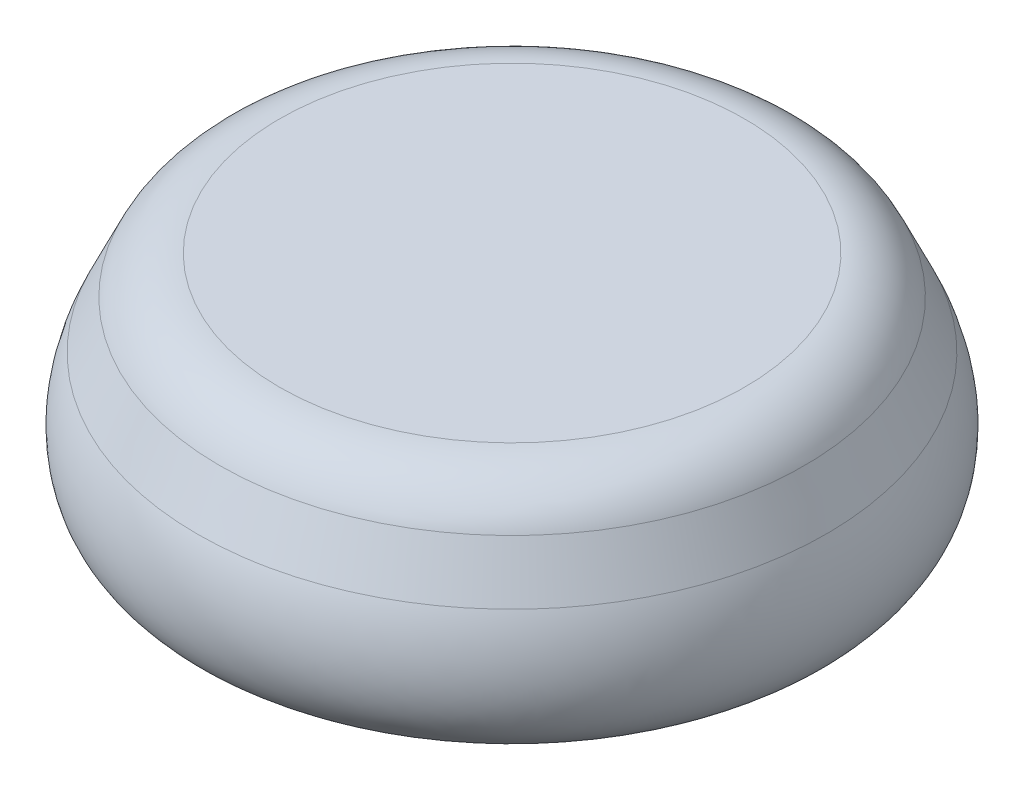
ISO-10303-21;
HEADER;
FILE_DESCRIPTION(('STEP AP214'),'2;1');
FILE_NAME('part.step','',(''),(''),'','','');
FILE_SCHEMA(('AUTOMOTIVE_DESIGN { 1 0 10303 214 1 1 1 1 }'));
ENDSEC;
DATA;
#1=APPLICATION_CONTEXT('core data for automotive mechanical design processes');
#2=APPLICATION_PROTOCOL_DEFINITION('international standard','automotive_design',2000,#1);
#3=PRODUCT_CONTEXT('',#1,'mechanical');
#4=PRODUCT('Part','Part','',(#3));
#5=PRODUCT_RELATED_PRODUCT_CATEGORY('part','',(#4));
#6=PRODUCT_DEFINITION_FORMATION('','',#4);
#7=PRODUCT_DEFINITION_CONTEXT('part definition',#1,'design');
#8=PRODUCT_DEFINITION('design','',#6,#7);
#9=PRODUCT_DEFINITION_SHAPE('','',#8);
#10=(LENGTH_UNIT() NAMED_UNIT(*) SI_UNIT(.MILLI.,.METRE.));
#11=(NAMED_UNIT(*) PLANE_ANGLE_UNIT() SI_UNIT($,.RADIAN.));
#12=(NAMED_UNIT(*) SI_UNIT($,.STERADIAN.) SOLID_ANGLE_UNIT());
#13=UNCERTAINTY_MEASURE_WITH_UNIT(LENGTH_MEASURE(1.E-05),#10,'distance_accuracy_value','');
#14=(GEOMETRIC_REPRESENTATION_CONTEXT(3) GLOBAL_UNCERTAINTY_ASSIGNED_CONTEXT((#13)) GLOBAL_UNIT_ASSIGNED_CONTEXT((#10,
#11,#12)) REPRESENTATION_CONTEXT('',''));
#15=CARTESIAN_POINT('',(0.,0.,0.));
#16=DIRECTION('',(0.,0.,1.));
#17=DIRECTION('',(1.,0.,0.));
#18=AXIS2_PLACEMENT_3D('',#15,#16,#17);
#19=CARTESIAN_POINT('',(-11.6679762873141,0.,0.596459581716547));
#20=DIRECTION('',(0.,-1.,0.));
#21=DIRECTION('',(0.,0.,1.));
#22=AXIS2_PLACEMENT_3D('',#19,#20,#21);
#23=CONICAL_SURFACE('',#22,50.,0.436332312998583);
#24=CARTESIAN_POINT('',(1.971137729193,-15.6207831098853,-55.0402335851226));
#25=CARTESIAN_POINT('',(5.64236667191444,-15.6207831099431,-54.1402464133692));
#26=CARTESIAN_POINT('',(9.16743775199461,-15.6210031784165,-52.894743181036));
#27=CARTESIAN_POINT('',(14.243639979586,-15.621651567128,-50.5268003486752));
#28=CARTESIAN_POINT('',(15.90021466265,-15.6219211342182,-49.653593232351));
#29=CARTESIAN_POINT('',(19.1405650034087,-15.6225698741891,-47.7351181115282));
#30=CARTESIAN_POINT('',(20.7243862406784,-15.6229500033657,-46.6881822347024));
#31=CARTESIAN_POINT('',(25.2613464455144,-15.6242303138001,-43.3575511813461));
#32=CARTESIAN_POINT('',(28.0391442339883,-15.625275570573,-40.865501455234));
#33=CARTESIAN_POINT('',(31.8369843340479,-15.6271299898261,-36.7215680331591));
#34=CARTESIAN_POINT('',(33.0464973622888,-15.6277997948163,-35.2646048722645));
#35=CARTESIAN_POINT('',(35.3092238797687,-15.6292220578336,-32.2458720922649));
#36=CARTESIAN_POINT('',(36.3579654939669,-15.6299706919091,-30.6918232195903));
#37=CARTESIAN_POINT('',(39.2634311790695,-15.632325895017,-25.899478337143));
#38=CARTESIAN_POINT('',(40.881697445195,-15.6340407196124,-22.5322288882323));
#39=CARTESIAN_POINT('',(42.8170945032546,-15.6368363939226,-17.2153082391851));
#40=CARTESIAN_POINT('',(43.3758064208412,-15.6378020851157,-15.4057033193318));
#41=CARTESIAN_POINT('',(44.3046518781029,-15.6397667785514,-11.7751654446573));
#42=CARTESIAN_POINT('',(44.6781495190115,-15.6407704165537,-9.94537783528216));
#43=CARTESIAN_POINT('',(45.2455896529415,-15.6428197478844,-6.25713390770196));
#44=CARTESIAN_POINT('',(45.4395336112451,-15.6438654408715,-4.39867782078086));
#45=CARTESIAN_POINT('',(45.644961907996,-15.645999570955,-0.652634540749525));
#46=CARTESIAN_POINT('',(45.6556385544505,-15.6470942671184,1.24559211638615));
#47=CARTESIAN_POINT('',(45.4077262851212,-15.6503884509901,6.88886791820799));
#48=CARTESIAN_POINT('',(44.8773319575814,-15.6525982983961,10.5849704928862));
#49=CARTESIAN_POINT('',(43.1021651834868,-15.6570448669042,17.8478785781363));
#50=CARTESIAN_POINT('',(41.8370203476568,-15.6593032545501,21.4471884357122));
#51=CARTESIAN_POINT('',(38.6715449427213,-15.6636711187045,28.2316470636949));
#52=CARTESIAN_POINT('',(36.771868441419,-15.6657961618882,31.4439125533216));
#53=CARTESIAN_POINT('',(33.4418755669411,-15.6688944077497,35.9894961084473));
#54=CARTESIAN_POINT('',(32.2447046447896,-15.6699167185447,37.4651802407817));
#55=CARTESIAN_POINT('',(29.7348491333675,-15.6718898047984,40.2643005876536));
#56=CARTESIAN_POINT('',(28.4188233150538,-15.6728445444926,41.5937791494662));
#57=CARTESIAN_POINT('',(24.291393885013,-15.6756153889683,45.3764965699799));
#58=CARTESIAN_POINT('',(21.299409308791,-15.6773405171972,47.6278657104503));
#59=CARTESIAN_POINT('',(14.8317854530362,-15.6805265960337,51.5546247459556));
#60=CARTESIAN_POINT('',(11.4585584279953,-15.681937552338,53.168627724657));
#61=CARTESIAN_POINT('',(6.19780596844434,-15.6837915314271,55.0861974189796));
#62=CARTESIAN_POINT('',(4.41048843804059,-15.6843654581605,55.6408600688656));
#63=CARTESIAN_POINT('',(0.766788107295939,-15.6854230840128,56.5771367790989));
#64=CARTESIAN_POINT('',(-1.09411303076597,-15.685907197346,56.9583593642882));
#65=CARTESIAN_POINT('',(-6.65951327192668,-15.6871914886198,57.8155452138973));
#66=CARTESIAN_POINT('',(-10.3853504394702,-15.687837574058,58.0196984811183));
#67=CARTESIAN_POINT('',(-17.8679704861788,-15.6887125729563,57.6988267685395));
#68=CARTESIAN_POINT('',(-21.6422931510177,-15.6889372553074,57.1621834494525));
#69=CARTESIAN_POINT('',(-27.1055683334721,-15.6889390708565,55.8260234890082));
#70=CARTESIAN_POINT('',(-28.9025851752225,-15.6888850369632,55.2920328274398));
#71=CARTESIAN_POINT('',(-32.4481364499676,-15.6886669271721,54.0456013995293));
#72=CARTESIAN_POINT('',(-34.2043851790198,-15.688501698097,53.3292748519063));
#73=CARTESIAN_POINT('',(-39.3287435372883,-15.6878447630083,50.9367754898072));
#74=CARTESIAN_POINT('',(-42.5547550481414,-15.687196060905,49.0238784052097));
#75=CARTESIAN_POINT('',(-47.1091400783055,-15.6859076945191,45.6788185409069));
#76=CARTESIAN_POINT('',(-48.5818124104418,-15.685423677082,44.4805495254316));
#77=CARTESIAN_POINT('',(-51.3737267083383,-15.6843685138478,41.9708674993467));
#78=CARTESIAN_POINT('',(-52.7005787318164,-15.6837955405553,40.6544280061905));
#79=CARTESIAN_POINT('',(-55.218558326715,-15.6825604533475,37.9005623702335));
#80=CARTESIAN_POINT('',(-56.4096834441434,-15.6818983377843,36.4631340485112));
#81=CARTESIAN_POINT('',(-58.6547531901579,-15.6804840209253,33.4659879818795));
#82=CARTESIAN_POINT('',(-59.7125266025193,-15.6797286503184,31.8998482917146));
#83=CARTESIAN_POINT('',(-62.6454351230221,-15.6773438054364,27.054809845952));
#84=CARTESIAN_POINT('',(-64.2549134302086,-15.6756226939282,23.6823611470962));
#85=CARTESIAN_POINT('',(-66.1672109848848,-15.6728506424561,18.416941003692));
#86=CARTESIAN_POINT('',(-66.7203806679788,-15.6718946633188,16.6270921573556));
#87=CARTESIAN_POINT('',(-67.6535803155524,-15.6699170426575,12.9760740711308));
#88=CARTESIAN_POINT('',(-68.0315784500175,-15.66889673991,11.1177183890556));
#89=CARTESIAN_POINT('',(-68.8808537954912,-15.6658045411301,5.55806977057889));
#90=CARTESIAN_POINT('',(-69.0812897613626,-15.6636801482925,1.832097221562));
#91=CARTESIAN_POINT('',(-68.8334415821681,-15.6603992332819,-3.78617350349871));
#92=CARTESIAN_POINT('',(-68.6570637940914,-15.6592836215607,-5.67406469201141));
#93=CARTESIAN_POINT('',(-68.1208992443613,-15.65705258903,-9.40473195370084));
#94=CARTESIAN_POINT('',(-67.7629020246927,-15.6559395501712,-11.2438220408474));
#95=CARTESIAN_POINT('',(-66.426413241468,-15.6526076680002,-16.6844780750949));
#96=CARTESIAN_POINT('',(-65.1879529867143,-15.6503959904024,-20.2101682389252));
#97=CARTESIAN_POINT('',(-62.79189550363,-15.6470932975912,-25.3415681594306));
#98=CARTESIAN_POINT('',(-61.9079204957815,-15.6460030510083,-27.0127696855218));
#99=CARTESIAN_POINT('',(-59.996968483425,-15.6438723898075,-30.2339831209112));
#100=CARTESIAN_POINT('',(-58.9667496216575,-15.6428274259795,-31.7910773926051));
#101=CARTESIAN_POINT('',(-56.7584440430585,-15.6407777827916,-34.799397645497));
#102=CARTESIAN_POINT('',(-55.5803598127069,-15.6397731027822,-36.2506254109226));
#103=CARTESIAN_POINT('',(-53.0736596327926,-15.6378047429865,-39.0453026510949));
#104=CARTESIAN_POINT('',(-51.7371662194253,-15.6368361666877,-40.3953028245152));
#105=CARTESIAN_POINT('',(-47.5726545026275,-15.6340472181851,-44.2052048725542));
#106=CARTESIAN_POINT('',(-44.5836269484919,-15.6323328742177,-46.4421609525183));
#107=CARTESIAN_POINT('',(-38.1879254953358,-15.6291887385514,-50.321083448219));
#108=CARTESIAN_POINT('',(-34.7464394216728,-15.6277500505127,-51.9699322073257));
#109=CARTESIAN_POINT('',(-27.7120769844649,-15.6252804256227,-54.5242796707261));
#110=CARTESIAN_POINT('',(-24.0961743804488,-15.6242339333559,-55.4510794971395));
#111=CARTESIAN_POINT('',(-18.522138250961,-15.6229506607422,-56.308172511352));
#112=CARTESIAN_POINT('',(-16.6317540341256,-15.6225702463703,-56.5039149369841));
#113=CARTESIAN_POINT('',(-12.8799005992346,-15.6219227379338,-56.7061451255895));
#114=CARTESIAN_POINT('',(-11.0097949141885,-15.6216532586949,-56.7146483254992));
#115=CARTESIAN_POINT('',(-5.4166029675394,-15.6210044240744,-56.4678042186029));
#116=CARTESIAN_POINT('',(-1.70009121352844,-15.6207831098276,-55.940220756876));
#117=CARTESIAN_POINT('',(1.971137729193,-15.6207831098853,-55.0402335851226));
#118=(BOUNDED_CURVE() B_SPLINE_CURVE(3,(#24,#25,#26,#27,#28,#29,#30,#31,#32,#33,#34,#35,#36,#37,
#38,#39,#40,#41,#42,#43,#44,#45,#46,#47,#48,#49,#50,#51,#52,#53,#54,#55,#56,#57,#58,#59,#60,#61,
#62,#63,#64,#65,#66,#67,#68,#69,#70,#71,#72,#73,#74,#75,#76,#77,#78,#79,#80,#81,#82,#83,#84,#85,
#86,#87,#88,#89,#90,#91,#92,#93,#94,#95,#96,#97,#98,#99,#100,#101,#102,#103,#104,#105,#106,#107,
#108,#109,#110,#111,#112,#113,#114,#115,#116,#117),.UNSPECIFIED.,.T.,
.F.) B_SPLINE_CURVE_WITH_KNOTS((4,2,2,2,2,2,2,2,2,2,2,2,2,2,2,2,2,2,2,2,2,2,2,2,2,2,2,2,2,2,2,2,
2,2,2,2,2,2,2,2,2,2,2,2,2,2,4),(0.0142917086560745,0.0228301725087836,0.0270994044351381,
0.0313686363614927,0.0399071002142017,0.0441763321405563,0.0484455640669108,0.0569840279196199,
0.0612532598459744,0.0655224917723289,0.0697917236986834,0.0740609556250379,0.082599419477747,
0.0911378833304561,0.0996763471831651,0.10394557910952,0.108214811035874,0.116753274888583,
0.125291738741292,0.129560970667647,0.133830202594001,0.14236866644671,0.150907130299419,
0.155176362225774,0.159445594152129,0.167984058004838,0.172253289931192,0.176522521857547,
0.180791753783901,0.185060985710256,0.193599449562965,0.197868681489319,0.202137913415674,
0.210676377268383,0.214945609194737,0.219214841121092,0.227753304973801,0.232022536900156,
0.23629176882651,0.240561000752865,0.244830232679219,0.253368696531928,0.261907160384637,
0.270445624237346,0.274714856163701,0.278984088090055,0.287522551942764),
.UNSPECIFIED.) CURVE() GEOMETRIC_REPRESENTATION_ITEM() RATIONAL_B_SPLINE_CURVE((1.,1.,1.,1.,1.,
1.,1.,1.,1.,1.,1.,1.,1.,1.,1.,1.,1.,1.,1.,1.,1.,1.,1.,1.,1.,1.,1.,1.,1.,1.,1.,1.,1.,1.,1.,1.,1.,
1.,1.,1.,1.,1.,1.,1.,1.,1.,1.,1.,1.,1.,1.,1.,1.,1.,1.,1.,1.,1.,1.,1.,1.,1.,1.,1.,1.,1.,1.,1.,1.,
1.,1.,1.,1.,1.,1.,1.,1.,1.,1.,1.,1.,1.,1.,1.,1.,1.,1.,1.,1.,1.,1.,1.,1.,1.)) REPRESENTATION_ITEM(''));
#119=CARTESIAN_POINT('',(1.971137729193,-15.6207831098853,-55.0402335851226));
#120=VERTEX_POINT('',#119);
#121=EDGE_CURVE('E53',#120,#120,#118,.F.);
#122=ORIENTED_EDGE('',*,*,#121,.T.);
#123=EDGE_LOOP('',(#122));
#124=FACE_BOUND('',#123,.T.);
#125=CARTESIAN_POINT('',(-11.6679762873141,-6.92858085911161,0.596459581716547));
#126=DIRECTION('',(0.,1.,0.));
#127=DIRECTION('',(0.,0.,1.));
#128=AXIS2_PLACEMENT_3D('',#125,#126,#127);
#129=CIRCLE('',#128,53.2308503147499);
#130=CARTESIAN_POINT('',(-11.6679762873141,-6.92858085911161,53.8273098964664));
#131=VERTEX_POINT('',#130);
#132=EDGE_CURVE('E58',#131,#131,#129,.F.);
#133=ORIENTED_EDGE('',*,*,#132,.T.);
#134=EDGE_LOOP('',(#133));
#135=FACE_BOUND('',#134,.T.);
#136=ADVANCED_FACE('F40',(#124,#135),#23,.T.);
#137=CARTESIAN_POINT('',(-11.6679762873141,0.,0.596459581716547));
#138=DIRECTION('',(0.,1.,0.));
#139=DIRECTION('',(0.,0.,1.));
#140=AXIS2_PLACEMENT_3D('',#137,#138,#139);
#141=PLANE('',#140);
#142=CARTESIAN_POINT('',(-11.6679762873141,0.,0.596459581716547));
#143=DIRECTION('',(0.,1.,0.));
#144=DIRECTION('',(0.,0.,1.));
#145=AXIS2_PLACEMENT_3D('',#142,#143,#144);
#146=CIRCLE('',#145,42.3551568703101);
#147=CARTESIAN_POINT('',(-11.6679762873141,0.,42.9516164520266));
#148=VERTEX_POINT('',#147);
#149=EDGE_CURVE('E63',#148,#148,#146,.T.);
#150=ORIENTED_EDGE('',*,*,#149,.T.);
#151=EDGE_LOOP('',(#150));
#152=FACE_BOUND('',#151,.T.);
#153=ADVANCED_FACE('F84',(#152),#141,.T.);
#154=CARTESIAN_POINT('',(-11.6833474460395,-35.,0.659161634106953));
#155=DIRECTION('',(0.,1.,0.));
#156=DIRECTION('',(0.,0.,-1.));
#157=AXIS2_PLACEMENT_3D('',#154,#155,#156);
#158=CONICAL_SURFACE('',#157,60.,0.959931088596882);
#159=CARTESIAN_POINT('',(1.46563890795772,-38.3430979217757,-52.9782020793204));
#160=CARTESIAN_POINT('',(-2.06844057507776,-38.3430979218494,-53.8445676065084));
#161=CARTESIAN_POINT('',(-5.64608430510887,-38.3433192359461,-54.3525543510306));
#162=CARTESIAN_POINT('',(-11.0303442897096,-38.3439680705945,-54.5905115763442));
#163=CARTESIAN_POINT('',(-12.8306023765053,-38.3442375497746,-54.5824650139975));
#164=CARTESIAN_POINT('',(-16.4423614536885,-38.3448850583102,-54.3881194957661));
#165=CARTESIAN_POINT('',(-18.2621767930258,-38.34526547268,-54.1998815578114));
#166=CARTESIAN_POINT('',(-23.6282083285189,-38.3465487451512,-53.3754399616813));
#167=CARTESIAN_POINT('',(-27.1092801944813,-38.3475952374403,-52.4837623184805));
#168=CARTESIAN_POINT('',(-33.881647944718,-38.3500648624757,-50.0259024389827));
#169=CARTESIAN_POINT('',(-37.1951181010362,-38.3515035505064,-48.4392191696077));
#170=CARTESIAN_POINT('',(-43.3532993723118,-38.3546476860433,-44.7062409849152));
#171=CARTESIAN_POINT('',(-46.2315233690075,-38.3563620299628,-42.5533261371209));
#172=CARTESIAN_POINT('',(-50.2419899215346,-38.3591509786343,-38.8862962743631));
#173=CARTESIAN_POINT('',(-51.5291073478851,-38.3601195549242,-37.5868816909223));
#174=CARTESIAN_POINT('',(-53.94332041309,-38.3620879146251,-34.8968329579657));
#175=CARTESIAN_POINT('',(-55.0780018138144,-38.3630925946852,-33.4998939963105));
#176=CARTESIAN_POINT('',(-57.2050754522927,-38.3651422378666,-30.6040156273863));
#177=CARTESIAN_POINT('',(-58.1974653098244,-38.3661872016621,-29.1050745241438));
#178=CARTESIAN_POINT('',(-60.0383843902516,-38.3683178629343,-26.004060885112));
#179=CARTESIAN_POINT('',(-60.890037317939,-38.3694081095483,-24.3951698008223));
#180=CARTESIAN_POINT('',(-63.1987112069741,-38.3727108021592,-19.4549265150021));
#181=CARTESIAN_POINT('',(-64.3923350084063,-38.374922479847,-16.0603611859591));
#182=CARTESIAN_POINT('',(-65.6809681203915,-38.3782543620833,-10.8217050600065));
#183=CARTESIAN_POINT('',(-66.0262701097144,-38.3793674008567,-9.05084058263944));
#184=CARTESIAN_POINT('',(-66.5437207304305,-38.3815984335145,-5.45845601428786));
#185=CARTESIAN_POINT('',(-66.7141448680993,-38.3827140452195,-3.64048451098502));
#186=CARTESIAN_POINT('',(-66.9545111694959,-38.3859949600881,1.76987605166958));
#187=CARTESIAN_POINT('',(-66.7625912662565,-38.3881193529476,5.35818688289609));
#188=CARTESIAN_POINT('',(-65.9462576189284,-38.3912115518367,10.7127271268789));
#189=CARTESIAN_POINT('',(-65.5827321433807,-38.3922318546078,12.502574901766));
#190=CARTESIAN_POINT('',(-64.6849614427885,-38.3942094751492,16.0190924840077));
#191=CARTESIAN_POINT('',(-64.1526724861333,-38.3951654543662,17.7430516711736));
#192=CARTESIAN_POINT('',(-62.3122462921197,-38.3979375057791,22.8147574898874));
#193=CARTESIAN_POINT('',(-60.7628976242108,-38.3996586172102,26.0632992476904));
#194=CARTESIAN_POINT('',(-57.9390760218358,-38.4020434622669,30.7305016581702));
#195=CARTESIAN_POINT('',(-56.9205781932819,-38.4027988328535,32.2391872334456));
#196=CARTESIAN_POINT('',(-54.7587449948996,-38.4042131496367,35.1264278724631));
#197=CARTESIAN_POINT('',(-53.6117232956416,-38.4048752652316,36.5111691749691));
#198=CARTESIAN_POINT('',(-51.1868690949258,-38.4061103524518,39.1641277352487));
#199=CARTESIAN_POINT('',(-49.9090389532442,-38.4066833256889,40.4323471173069));
#200=CARTESIAN_POINT('',(-47.2201809478451,-38.4077384890215,42.8501212494342));
#201=CARTESIAN_POINT('',(-45.8018232938893,-38.4082225064473,44.0045185048091));
#202=CARTESIAN_POINT('',(-41.4152927199258,-38.4095108727195,47.2271173714146));
#203=CARTESIAN_POINT('',(-38.3080258019069,-38.4101595748183,49.0699976055752));
#204=CARTESIAN_POINT('',(-33.3721400601779,-38.4108165100275,51.3748747670669));
#205=CARTESIAN_POINT('',(-31.6804624307755,-38.410981739089,52.0649567229616));
#206=CARTESIAN_POINT('',(-28.265238122576,-38.4111998488268,53.2656910174986));
#207=CARTESIAN_POINT('',(-26.5342609203669,-38.4112538827303,53.7800868712779));
#208=CARTESIAN_POINT('',(-21.2717385656867,-38.4112520672307,55.067147502163));
#209=CARTESIAN_POINT('',(-17.636079704422,-38.4110273849224,55.5839567161394));
#210=CARTESIAN_POINT('',(-10.4284407952369,-38.4101523858725,55.8925856396262));
#211=CARTESIAN_POINT('',(-6.83956515681336,-38.4095063004109,55.6955990371273));
#212=CARTESIAN_POINT('',(-1.47890180123004,-38.408222009286,54.8692777859068));
#213=CARTESIAN_POINT('',(0.313515414588963,-38.4077378959515,54.5018293953104));
#214=CARTESIAN_POINT('',(3.82305639606687,-38.4066802700025,53.5994637104236));
#215=CARTESIAN_POINT('',(5.54453261035265,-38.4061063433312,53.0649232389711));
#216=CARTESIAN_POINT('',(10.6113738786694,-38.4042523642008,51.2170191263282));
#217=CARTESIAN_POINT('',(13.8601072104489,-38.4028414077975,49.6617661930795));
#218=CARTESIAN_POINT('',(20.0886384293771,-38.399655329214,45.8782511971487));
#219=CARTESIAN_POINT('',(22.9698093160152,-38.3979302008358,43.7091382471387));
#220=CARTESIAN_POINT('',(26.9440452513576,-38.3951593563944,40.0648853144147));
#221=CARTESIAN_POINT('',(28.2111664152815,-38.3942046166418,38.7841102426017));
#222=CARTESIAN_POINT('',(30.6276314386861,-38.3922315304819,36.0876225200438));
#223=CARTESIAN_POINT('',(31.7801911562866,-38.3912092196903,34.6660898724661));
#224=CARTESIAN_POINT('',(34.9859024100031,-38.3881109736779,30.2874577798826));
#225=CARTESIAN_POINT('',(36.8144069277817,-38.3859859305309,27.1933614257662));
#226=CARTESIAN_POINT('',(39.8607453545883,-38.3816180665044,20.6589291148019));
#227=CARTESIAN_POINT('',(41.0779398224489,-38.3793596788569,17.1924832329593));
#228=CARTESIAN_POINT('',(42.7851093345914,-38.374913110224,10.198142713543));
#229=CARTESIAN_POINT('',(43.2946934911099,-38.372703262775,6.63893848935375));
#230=CARTESIAN_POINT('',(43.5317121387242,-38.3694090790614,1.20502305751166));
#231=CARTESIAN_POINT('',(43.5208667332187,-38.3683143828953,-0.622724379259606));
#232=CARTESIAN_POINT('',(43.3219721975594,-38.3661802527119,-4.22957383045119));
#233=CARTESIAN_POINT('',(43.1346975468859,-38.3651345597811,-6.01892080044004));
#234=CARTESIAN_POINT('',(42.587307119905,-38.3630852284376,-9.56991368259866));
#235=CARTESIAN_POINT('',(42.2271899103163,-38.3620815903977,-11.3315593581701));
#236=CARTESIAN_POINT('',(41.3319154268384,-38.36011689705,-14.8268029153241));
#237=CARTESIAN_POINT('',(40.7935170415247,-38.3591512058775,-16.5689249554547));
#238=CARTESIAN_POINT('',(38.9288091687007,-38.3563555313736,-21.6874448825342));
#239=CARTESIAN_POINT('',(37.3700161810357,-38.3546407068671,-24.9288784864564));
#240=CARTESIAN_POINT('',(34.5717975113798,-38.3522855038195,-29.5419914489884));
#241=CARTESIAN_POINT('',(33.5618323800578,-38.3515368696591,-31.0378897874771));
#242=CARTESIAN_POINT('',(31.382894845986,-38.3501146067714,-33.9436192492218));
#243=CARTESIAN_POINT('',(30.2182293918357,-38.3494448017575,-35.3460184807497));
#244=CARTESIAN_POINT('',(26.5613709389987,-38.3475903823811,-39.3347114961119));
#245=CARTESIAN_POINT('',(23.8868926625451,-38.3465451256142,-41.7333376656945));
#246=CARTESIAN_POINT('',(19.5189289505985,-38.3452648152942,-44.9390899873192));
#247=CARTESIAN_POINT('',(17.9941412262379,-38.3448846861395,-45.9467684747838));
#248=CARTESIAN_POINT('',(14.8746312766253,-38.3442359460486,-47.793311472265));
#249=CARTESIAN_POINT('',(13.2798646426592,-38.3439663790314,-48.6337813401832));
#250=CARTESIAN_POINT('',(8.39312818507962,-38.3433179902807,-50.9129744935584));
#251=CARTESIAN_POINT('',(4.9997183909932,-38.3430979217019,-52.1118365521324));
#252=CARTESIAN_POINT('',(1.46563890795772,-38.3430979217757,-52.9782020793204));
#253=(BOUNDED_CURVE() B_SPLINE_CURVE(3,(#159,#160,#161,#162,#163,#164,#165,#166,#167,#168,#169,
#170,#171,#172,#173,#174,#175,#176,#177,#178,#179,#180,#181,#182,#183,#184,#185,#186,#187,#188,
#189,#190,#191,#192,#193,#194,#195,#196,#197,#198,#199,#200,#201,#202,#203,#204,#205,#206,#207,
#208,#209,#210,#211,#212,#213,#214,#215,#216,#217,#218,#219,#220,#221,#222,#223,#224,#225,#226,
#227,#228,#229,#230,#231,#232,#233,#234,#235,#236,#237,#238,#239,#240,#241,#242,#243,#244,#245,
#246,#247,#248,#249,#250,#251,#252),.UNSPECIFIED.,.T.,.F.) B_SPLINE_CURVE_WITH_KNOTS((4,2,2,2,2,
2,2,2,2,2,2,2,2,2,2,2,2,2,2,2,2,2,2,2,2,2,2,2,2,2,2,2,2,2,2,2,2,2,2,2,2,2,2,2,2,2,4),
(0.0142917086560745,0.0228301725087836,0.0270994044351381,0.0313686363614926,0.0399071002142017,
0.0484455640669108,0.0569840279196198,0.0612532598459744,0.0655224917723289,0.0697917236986834,
0.0740609556250379,0.082599419477747,0.0868686514041015,0.0911378833304561,0.0996763471831651,
0.10394557910952,0.108214811035874,0.116753274888583,0.121022506814938,0.125291738741292,
0.129560970667647,0.133830202594001,0.14236866644671,0.146637898373065,0.150907130299419,
0.159445594152129,0.167984058004838,0.172253289931192,0.176522521857547,0.185060985710256,
0.193599449562965,0.197868681489319,0.202137913415674,0.210676377268383,0.219214841121092,
0.227753304973801,0.232022536900156,0.23629176882651,0.240561000752865,0.244830232679219,
0.253368696531928,0.257637928458283,0.261907160384637,0.270445624237346,0.274714856163701,
0.278984088090055,0.287522551942764),
.UNSPECIFIED.) CURVE() GEOMETRIC_REPRESENTATION_ITEM() RATIONAL_B_SPLINE_CURVE((0.999999999999999,
0.999999999999999,0.999999999999999,0.999999999999999,0.999999999999999,0.999999999999999,
0.999999999999999,0.999999999999999,0.999999999999999,0.999999999999999,0.999999999999999,
0.999999999999999,0.999999999999999,0.999999999999999,0.999999999999999,0.999999999999999,
0.999999999999999,0.999999999999999,0.999999999999999,0.999999999999999,0.999999999999999,
0.999999999999999,0.999999999999999,0.999999999999999,0.999999999999999,0.999999999999999,
0.999999999999999,0.999999999999999,0.999999999999999,0.999999999999999,0.999999999999999,
0.999999999999999,0.999999999999999,0.999999999999999,0.999999999999999,0.999999999999999,
0.999999999999999,0.999999999999999,0.999999999999999,0.999999999999999,0.999999999999999,
0.999999999999999,0.999999999999999,0.999999999999999,0.999999999999999,0.999999999999999,
0.999999999999999,0.999999999999999,0.999999999999999,0.999999999999999,0.999999999999999,
0.999999999999999,0.999999999999999,0.999999999999999,0.999999999999999,0.999999999999999,
0.999999999999999,0.999999999999999,0.999999999999999,0.999999999999999,0.999999999999999,
0.999999999999999,0.999999999999999,0.999999999999999,0.999999999999999,0.999999999999999,
0.999999999999999,0.999999999999999,0.999999999999999,0.999999999999999,0.999999999999999,
0.999999999999999,0.999999999999999,0.999999999999999,0.999999999999999,0.999999999999999,
0.999999999999999,0.999999999999999,0.999999999999999,0.999999999999999,0.999999999999999,
0.999999999999999,0.999999999999999,0.999999999999999,0.999999999999999,0.999999999999999,
0.999999999999999,0.999999999999999,0.999999999999999,0.999999999999999,0.999999999999999,
0.999999999999999,0.999999999999999,0.999999999999999)) REPRESENTATION_ITEM(''));
#254=CARTESIAN_POINT('',(1.46563890795772,-38.3430979217757,-52.9782020793204));
#255=VERTEX_POINT('',#254);
#256=EDGE_CURVE('E11',#255,#255,#253,.F.);
#257=ORIENTED_EDGE('',*,*,#256,.T.);
#258=EDGE_LOOP('',(#257));
#259=FACE_BOUND('',#258,.T.);
#260=CARTESIAN_POINT('',(-11.6833474460395,-66.9255847529129,0.659161634106953));
#261=DIRECTION('',(0.,1.,0.));
#262=DIRECTION('',(0.,0.,1.));
#263=AXIS2_PLACEMENT_3D('',#260,#261,#262);
#264=CIRCLE('',#263,14.4055397710509);
#265=CARTESIAN_POINT('',(-11.6833474460395,-66.9255847529129,15.0647014051579));
#266=VERTEX_POINT('',#265);
#267=EDGE_CURVE('E68',#266,#266,#264,.T.);
#268=ORIENTED_EDGE('',*,*,#267,.T.);
#269=EDGE_LOOP('',(#268));
#270=FACE_BOUND('',#269,.T.);
#271=ADVANCED_FACE('F101',(#259,#270),#158,.T.);
#272=CARTESIAN_POINT('',(-11.6679762873141,-70.,0.596459581716547));
#273=DIRECTION('',(0.,1.,0.));
#274=DIRECTION('',(0.,0.,1.));
#275=AXIS2_PLACEMENT_3D('',#272,#273,#274);
#276=PLANE('',#275);
#277=CARTESIAN_POINT('',(-11.6833474460395,-70.,0.659161634106953));
#278=DIRECTION('',(0.,1.,0.));
#279=DIRECTION('',(0.,0.,1.));
#280=AXIS2_PLACEMENT_3D('',#277,#278,#279);
#281=CIRCLE('',#280,4.65474035308317);
#282=CARTESIAN_POINT('',(-11.6833474460395,-70.,5.31390198719012));
#283=VERTEX_POINT('',#282);
#284=EDGE_CURVE('E131',#283,#283,#281,.F.);
#285=ORIENTED_EDGE('',*,*,#284,.T.);
#286=EDGE_LOOP('',(#285));
#287=FACE_BOUND('',#286,.T.);
#288=ADVANCED_FACE('F95',(#287),#276,.F.);
#289=CARTESIAN_POINT('',(-11.6833474460395,-53.,0.659161634106953));
#290=DIRECTION('',(0.,1.,0.));
#291=DIRECTION('',(0.,0.,1.));
#292=AXIS2_PLACEMENT_3D('',#289,#290,#291);
#293=DEGENERATE_TOROIDAL_SURFACE('',#292,4.65474035308317,17.,.T.);
#294=ORIENTED_EDGE('',*,*,#267,.F.);
#295=EDGE_LOOP('',(#294));
#296=FACE_BOUND('',#295,.T.);
#297=ORIENTED_EDGE('',*,*,#284,.F.);
#298=EDGE_LOOP('',(#297));
#299=FACE_BOUND('',#298,.T.);
#300=ADVANCED_FACE('F85',(#296,#299),#293,.T.);
#301=CARTESIAN_POINT('',(-11.6679762873141,-12.,0.596459581716547));
#302=DIRECTION('',(0.,1.,0.));
#303=DIRECTION('',(0.,0.,1.));
#304=AXIS2_PLACEMENT_3D('',#301,#302,#303);
#305=TOROIDAL_SURFACE('',#304,42.3551568703101,12.);
#306=ORIENTED_EDGE('',*,*,#132,.F.);
#307=EDGE_LOOP('',(#306));
#308=FACE_BOUND('',#307,.T.);
#309=ORIENTED_EDGE('',*,*,#149,.F.);
#310=EDGE_LOOP('',(#309));
#311=FACE_BOUND('',#310,.T.);
#312=ADVANCED_FACE('F87',(#308,#311),#305,.T.);
#313=CARTESIAN_POINT('',(1.971137729193,-15.6207831098853,-55.0402335851226));
#314=CARTESIAN_POINT('',(-1.70009121352844,-15.6207831098276,-55.940220756876));
#315=CARTESIAN_POINT('',(-5.4166029675394,-15.6210044240744,-56.4678042186029));
#316=CARTESIAN_POINT('',(-11.0097949141885,-15.6216532586949,-56.7146483254992));
#317=CARTESIAN_POINT('',(-12.8799005992346,-15.6219227379338,-56.7061451255895));
#318=CARTESIAN_POINT('',(-16.6317540341256,-15.6225702463703,-56.5039149369841));
#319=CARTESIAN_POINT('',(-18.522138250961,-15.6229506607422,-56.308172511352));
#320=CARTESIAN_POINT('',(-24.0961743804488,-15.6242339333559,-55.4510794971395));
#321=CARTESIAN_POINT('',(-27.7120769844649,-15.6252804256227,-54.5242796707261));
#322=CARTESIAN_POINT('',(-34.7464394216728,-15.6277500505127,-51.9699322073257));
#323=CARTESIAN_POINT('',(-38.1879254953358,-15.6291887385514,-50.321083448219));
#324=CARTESIAN_POINT('',(-44.5836269484919,-15.6323328742177,-46.4421609525183));
#325=CARTESIAN_POINT('',(-47.5726545026275,-15.6340472181851,-44.2052048725542));
#326=CARTESIAN_POINT('',(-51.7371662194253,-15.6368361666877,-40.3953028245152));
#327=CARTESIAN_POINT('',(-53.0736596327926,-15.6378047429865,-39.0453026510949));
#328=CARTESIAN_POINT('',(-55.5803598127069,-15.6397731027822,-36.2506254109226));
#329=CARTESIAN_POINT('',(-56.7584440430585,-15.6407777827916,-34.799397645497));
#330=CARTESIAN_POINT('',(-58.9667496216575,-15.6428274259795,-31.7910773926051));
#331=CARTESIAN_POINT('',(-59.996968483425,-15.6438723898075,-30.2339831209112));
#332=CARTESIAN_POINT('',(-61.9079204957815,-15.6460030510083,-27.0127696855218));
#333=CARTESIAN_POINT('',(-62.79189550363,-15.6470932975912,-25.3415681594306));
#334=CARTESIAN_POINT('',(-65.1879529867143,-15.6503959904024,-20.2101682389252));
#335=CARTESIAN_POINT('',(-66.426413241468,-15.6526076680002,-16.6844780750949));
#336=CARTESIAN_POINT('',(-67.7629020246927,-15.6559395501712,-11.2438220408474));
#337=CARTESIAN_POINT('',(-68.1208992443613,-15.65705258903,-9.40473195370084));
#338=CARTESIAN_POINT('',(-68.6570637940914,-15.6592836215607,-5.67406469201141));
#339=CARTESIAN_POINT('',(-68.8334415821681,-15.6603992332819,-3.78617350349871));
#340=CARTESIAN_POINT('',(-69.0812897613626,-15.6636801482925,1.832097221562));
#341=CARTESIAN_POINT('',(-68.8808537954912,-15.6658045411301,5.55806977057889));
#342=CARTESIAN_POINT('',(-68.0315784500175,-15.66889673991,11.1177183890556));
#343=CARTESIAN_POINT('',(-67.6535803155524,-15.6699170426575,12.9760740711308));
#344=CARTESIAN_POINT('',(-66.7203806679788,-15.6718946633188,16.6270921573556));
#345=CARTESIAN_POINT('',(-66.1672109848848,-15.6728506424561,18.416941003692));
#346=CARTESIAN_POINT('',(-64.2549134302086,-15.6756226939282,23.6823611470962));
#347=CARTESIAN_POINT('',(-62.6454351230221,-15.6773438054364,27.054809845952));
#348=CARTESIAN_POINT('',(-59.7125266025193,-15.6797286503184,31.8998482917146));
#349=CARTESIAN_POINT('',(-58.6547531901579,-15.6804840209253,33.4659879818795));
#350=CARTESIAN_POINT('',(-56.4096834441434,-15.6818983377843,36.4631340485112));
#351=CARTESIAN_POINT('',(-55.218558326715,-15.6825604533475,37.9005623702335));
#352=CARTESIAN_POINT('',(-52.7005787318164,-15.6837955405553,40.6544280061905));
#353=CARTESIAN_POINT('',(-51.3737267083383,-15.6843685138478,41.9708674993467));
#354=CARTESIAN_POINT('',(-48.5818124104418,-15.685423677082,44.4805495254316));
#355=CARTESIAN_POINT('',(-47.1091400783055,-15.6859076945191,45.6788185409069));
#356=CARTESIAN_POINT('',(-42.5547550481414,-15.687196060905,49.0238784052097));
#357=CARTESIAN_POINT('',(-39.3287435372883,-15.6878447630083,50.9367754898072));
#358=CARTESIAN_POINT('',(-34.2043851790198,-15.688501698097,53.3292748519063));
#359=CARTESIAN_POINT('',(-32.4481364499676,-15.6886669271721,54.0456013995293));
#360=CARTESIAN_POINT('',(-28.9025851752225,-15.6888850369632,55.2920328274398));
#361=CARTESIAN_POINT('',(-27.1055683334721,-15.6889390708565,55.8260234890082));
#362=CARTESIAN_POINT('',(-21.6422931510177,-15.6889372553074,57.1621834494525));
#363=CARTESIAN_POINT('',(-17.8679704861788,-15.6887125729563,57.6988267685395));
#364=CARTESIAN_POINT('',(-10.3853504394702,-15.687837574058,58.0196984811183));
#365=CARTESIAN_POINT('',(-6.65951327192668,-15.6871914886198,57.8155452138973));
#366=CARTESIAN_POINT('',(-1.09411303076597,-15.685907197346,56.9583593642882));
#367=CARTESIAN_POINT('',(0.766788107295939,-15.6854230840128,56.5771367790989));
#368=CARTESIAN_POINT('',(4.41048843804059,-15.6843654581605,55.6408600688656));
#369=CARTESIAN_POINT('',(6.19780596844434,-15.6837915314271,55.0861974189796));
#370=CARTESIAN_POINT('',(11.4585584279953,-15.681937552338,53.168627724657));
#371=CARTESIAN_POINT('',(14.8317854530362,-15.6805265960337,51.5546247459556));
#372=CARTESIAN_POINT('',(21.299409308791,-15.6773405171972,47.6278657104503));
#373=CARTESIAN_POINT('',(24.291393885013,-15.6756153889683,45.3764965699799));
#374=CARTESIAN_POINT('',(28.4188233150538,-15.6728445444926,41.5937791494662));
#375=CARTESIAN_POINT('',(29.7348491333675,-15.6718898047984,40.2643005876536));
#376=CARTESIAN_POINT('',(32.2447046447896,-15.6699167185447,37.4651802407817));
#377=CARTESIAN_POINT('',(33.4418755669411,-15.6688944077497,35.9894961084473));
#378=CARTESIAN_POINT('',(36.771868441419,-15.6657961618882,31.4439125533216));
#379=CARTESIAN_POINT('',(38.6715449427213,-15.6636711187045,28.2316470636949));
#380=CARTESIAN_POINT('',(41.8370203476568,-15.6593032545501,21.4471884357122));
#381=CARTESIAN_POINT('',(43.1021651834868,-15.6570448669042,17.8478785781363));
#382=CARTESIAN_POINT('',(44.8773319575814,-15.6525982983961,10.5849704928862));
#383=CARTESIAN_POINT('',(45.4077262851212,-15.6503884509901,6.88886791820799));
#384=CARTESIAN_POINT('',(45.6556385544505,-15.6470942671184,1.24559211638615));
#385=CARTESIAN_POINT('',(45.644961907996,-15.645999570955,-0.652634540749525));
#386=CARTESIAN_POINT('',(45.4395336112451,-15.6438654408715,-4.39867782078086));
#387=CARTESIAN_POINT('',(45.2455896529415,-15.6428197478844,-6.25713390770196));
#388=CARTESIAN_POINT('',(44.6781495190115,-15.6407704165537,-9.94537783528216));
#389=CARTESIAN_POINT('',(44.3046518781029,-15.6397667785514,-11.7751654446573));
#390=CARTESIAN_POINT('',(43.3758064208412,-15.6378020851157,-15.4057033193318));
#391=CARTESIAN_POINT('',(42.8170945032546,-15.6368363939226,-17.2153082391851));
#392=CARTESIAN_POINT('',(40.881697445195,-15.6340407196124,-22.5322288882323));
#393=CARTESIAN_POINT('',(39.2634311790695,-15.632325895017,-25.899478337143));
#394=CARTESIAN_POINT('',(36.3579654939669,-15.6299706919091,-30.6918232195903));
#395=CARTESIAN_POINT('',(35.3092238797687,-15.6292220578336,-32.2458720922649));
#396=CARTESIAN_POINT('',(33.0464973622888,-15.6277997948163,-35.2646048722645));
#397=CARTESIAN_POINT('',(31.8369843340479,-15.6271299898261,-36.7215680331591));
#398=CARTESIAN_POINT('',(28.0391442339883,-15.625275570573,-40.865501455234));
#399=CARTESIAN_POINT('',(25.2613464455144,-15.6242303138001,-43.3575511813461));
#400=CARTESIAN_POINT('',(20.7243862406784,-15.6229500033657,-46.6881822347024));
#401=CARTESIAN_POINT('',(19.1405650034087,-15.6225698741891,-47.7351181115282));
#402=CARTESIAN_POINT('',(15.90021466265,-15.6219211342182,-49.653593232351));
#403=CARTESIAN_POINT('',(14.243639979586,-15.621651567128,-50.5268003486752));
#404=CARTESIAN_POINT('',(9.16743775199461,-15.6210031784165,-52.894743181036));
#405=CARTESIAN_POINT('',(5.64236667191444,-15.6207831099431,-54.1402464133692));
#406=CARTESIAN_POINT('',(1.971137729193,-15.6207831098853,-55.0402335851226));
#407=CARTESIAN_POINT('',(3.74851774609965,-31.6294662850001,-62.2905246613483));
#408=CARTESIAN_POINT('',(-0.400154270784662,-31.6294662849801,-63.3075551033862));
#409=CARTESIAN_POINT('',(-4.59997796247134,-31.629687602835,-63.9038352574876));
#410=CARTESIAN_POINT('',(-10.9205776427105,-31.6303364478691,-64.1830323589112));
#411=CARTESIAN_POINT('',(-13.0339021717758,-31.6306059313744,-64.1735275121241));
#412=CARTESIAN_POINT('',(-17.2737341478721,-31.6312534499852,-63.9452445350427));
#413=CARTESIAN_POINT('',(-19.4100016135894,-31.6316338702433,-63.724189733607));
#414=CARTESIAN_POINT('',(-25.7091129289081,-31.6329171621416,-62.7561057937865));
#415=CARTESIAN_POINT('',(-29.7954521553075,-31.6339636697341,-61.7091497103627));
#416=CARTESIAN_POINT('',(-37.7452283017701,-31.6364333282909,-58.8234059820762));
#417=CARTESIAN_POINT('',(-41.6346921907729,-31.6378720347725,-56.960550272142));
#418=CARTESIAN_POINT('',(-48.8632106510542,-31.6410162067415,-52.5779505468019));
#419=CARTESIAN_POINT('',(-52.2416056422854,-31.6427305687706,-50.0504331340478));
#420=CARTESIAN_POINT('',(-56.94885987992,-31.6455195427411,-45.7454598493724));
#421=CARTESIAN_POINT('',(-58.4595781838471,-31.6464881272361,-44.22000643906));
#422=CARTESIAN_POINT('',(-61.2931420378753,-31.6484565021579,-41.0620503410749));
#423=CARTESIAN_POINT('',(-62.6248914556993,-31.6494611892546,-39.4221459095748));
#424=CARTESIAN_POINT('',(-65.1213351526077,-31.6515108453116,-36.0226367303588));
#425=CARTESIAN_POINT('',(-66.2860266411907,-31.6525558149266,-34.2630299721563));
#426=CARTESIAN_POINT('',(-68.44651363847,-31.6546864863151,-30.6227945111892));
#427=CARTESIAN_POINT('',(-69.4459748288618,-31.6557767372933,-28.7341618001264));
#428=CARTESIAN_POINT('',(-72.1552331524967,-31.6590794405955,-22.9350177537799));
#429=CARTESIAN_POINT('',(-73.5558257380112,-31.6612911218437,-18.9503716119747));
#430=CARTESIAN_POINT('',(-75.0676766470911,-31.6646230041112,-12.8012210665138));
#431=CARTESIAN_POINT('',(-75.472739550123,-31.6657360420627,-10.7225986855194));
#432=CARTESIAN_POINT('',(-76.079617422069,-31.6679670711326,-6.50594406679921));
#433=CARTESIAN_POINT('',(-76.2794087673315,-31.6690826801596,-4.37207740425991));
#434=CARTESIAN_POINT('',(-76.5608196961883,-31.6723635847004,1.97832941935279));
#435=CARTESIAN_POINT('',(-76.3350863795004,-31.6744879673447,6.19001235094753));
#436=CARTESIAN_POINT('',(-75.376271315295,-31.6775801468768,12.4746310430039));
#437=CARTESIAN_POINT('',(-74.9493773582474,-31.6786004424839,14.5753518864892));
#438=CARTESIAN_POINT('',(-73.8952386938354,-31.6805780478637,18.7026026056054));
#439=CARTESIAN_POINT('',(-73.2702903101623,-31.6815340189641,20.725951398052));
#440=CARTESIAN_POINT('',(-71.1096209322094,-31.6843060452697,26.6783781468821));
#441=CARTESIAN_POINT('',(-69.2908315391602,-31.6860271386514,30.4909711592393));
#442=CARTESIAN_POINT('',(-65.9761378414938,-31.6884119560171,35.9684752265222));
#443=CARTESIAN_POINT('',(-64.7806206097963,-31.6891673174096,37.7390799082552));
#444=CARTESIAN_POINT('',(-62.2431040357937,-31.6905816163767,41.1275477878296));
#445=CARTESIAN_POINT('',(-60.8967775387465,-31.6912437232064,42.7526712480929));
#446=CARTESIAN_POINT('',(-58.0506298399937,-31.692478793617,45.8661525867625));
#447=CARTESIAN_POINT('',(-56.5508114089587,-31.6930517588183,47.3545129437463));
#448=CARTESIAN_POINT('',(-53.394877281915,-31.6941069068678,50.1919624947546));
#449=CARTESIAN_POINT('',(-51.7301588250998,-31.6945909171145,51.5467347060807));
#450=CARTESIAN_POINT('',(-46.5817630736663,-31.6958792639735,55.3286930342128));
#451=CARTESIAN_POINT('',(-42.9348819092125,-31.6965279557512,57.4914436701605));
#452=CARTESIAN_POINT('',(-37.1418829557339,-31.6971848803487,60.1964020973826));
#453=CARTESIAN_POINT('',(-35.1564565746182,-31.6973501067342,61.0062729700853));
#454=CARTESIAN_POINT('',(-31.1482139084306,-31.697568212939,62.4154516158702));
#455=CARTESIAN_POINT('',(-29.1166767763498,-31.697622245949,63.0191526851091));
#456=CARTESIAN_POINT('',(-22.9403998325239,-31.6976204304668,64.5296916476767));
#457=CARTESIAN_POINT('',(-18.6734772489106,-31.6973957518322,65.1362855578199));
#458=CARTESIAN_POINT('',(-10.2143337865818,-31.6965207669251,65.4986957018488));
#459=CARTESIAN_POINT('',(-6.00228384504364,-31.6958746917416,65.2676482699165));
#460=CARTESIAN_POINT('',(0.289273311859275,-31.6945904199568,64.2981191649532));
#461=CARTESIAN_POINT('',(2.39295976962835,-31.6941063138133,63.866968885441));
#462=CARTESIAN_POINT('',(6.51199186652766,-31.693048703169,62.8081316898249));
#463=CARTESIAN_POINT('',(8.53244562598753,-31.6924747845502,62.1808871431183));
#464=CARTESIAN_POINT('',(14.47932006601,-31.6906208306681,60.0124630424746));
#465=CARTESIAN_POINT('',(18.2923756278496,-31.6892098924441,58.1874024522761));
#466=CARTESIAN_POINT('',(25.6030042832802,-31.6860238505574,53.7473857393591));
#467=CARTESIAN_POINT('',(28.9848159768524,-31.684298740378,51.2018414375721));
#468=CARTESIAN_POINT('',(33.6497658723455,-31.681527921055,46.9250487106033));
#469=CARTESIAN_POINT('',(35.1371352010806,-31.680573189388,45.4219506912783));
#470=CARTESIAN_POINT('',(37.9736766987984,-31.6786001183661,42.2573552406264));
#471=CARTESIAN_POINT('',(39.3266242172866,-31.6775778147349,40.5890271245019));
#472=CARTESIAN_POINT('',(43.0897730732718,-31.6744795881474,35.4501481838097));
#473=CARTESIAN_POINT('',(45.2363501594583,-31.6723545551463,31.8187543522942));
#474=CARTESIAN_POINT('',(48.8128363341454,-31.66798670492,24.1494114358085));
#475=CARTESIAN_POINT('',(50.2419989761919,-31.6657283208793,20.0808143985438));
#476=CARTESIAN_POINT('',(52.2467680123341,-31.6612817522363,11.8712990317412));
#477=CARTESIAN_POINT('',(52.8453945769112,-31.6590719011784,7.69363454246286));
#478=CARTESIAN_POINT('',(53.1243256159615,-31.6557777068139,1.31535707219646));
#479=CARTESIAN_POINT('',(53.1118353847915,-31.6546830062511,-0.830059341180293));
#480=CARTESIAN_POINT('',(52.8788368844531,-31.6525488659517,-5.06383748827774));
#481=CARTESIAN_POINT('',(52.6592390702415,-31.6515031671709,-7.16422457602708));
#482=CARTESIAN_POINT('',(52.0171429620857,-31.6494538229679,-11.3325244291634));
#483=CARTESIAN_POINT('',(51.5946429917854,-31.6484501778874,-13.4004369362274));
#484=CARTESIAN_POINT('',(50.5441556383975,-31.6464854693357,-17.503376958323));
#485=CARTESIAN_POINT('',(49.9123646369432,-31.6455197699875,-19.5484108994536));
#486=CARTESIAN_POINT('',(47.7240606335677,-31.6427240701197,-25.5569677662956));
#487=CARTESIAN_POINT('',(45.8946032727256,-31.6410092274698,-29.3621109085569));
#488=CARTESIAN_POINT('',(42.6103114631162,-31.6386539971724,-34.7775499565398));
#489=CARTESIAN_POINT('',(41.424879571247,-31.6379053539451,-36.5336319156659));
#490=CARTESIAN_POINT('',(38.8673297202651,-31.6364830730066,-39.9447784256673));
#491=CARTESIAN_POINT('',(37.5002668004389,-31.6358132591708,-41.5911184625171));
#492=CARTESIAN_POINT('',(33.2078449731253,-31.6339588146068,-46.273646523381));
#493=CARTESIAN_POINT('',(30.0684550594973,-31.6329135425712,-49.0895428871806));
#494=CARTESIAN_POINT('',(24.9410925630671,-31.6316332128369,-52.8529824043471));
#495=CARTESIAN_POINT('',(23.151194484418,-31.6312530778061,-54.0359627150726));
#496=CARTESIAN_POINT('',(19.489277626574,-31.6306043276259,-56.2037390410368));
#497=CARTESIAN_POINT('',(17.6172069509874,-31.6303347562759,-57.1904196736031));
#498=CARTESIAN_POINT('',(11.8807171062078,-31.6296863571555,-59.8660971767835));
#499=CARTESIAN_POINT('',(7.89718976298398,-31.6294662850201,-61.2734942193105));
#500=CARTESIAN_POINT('',(3.74851774609965,-31.6294662850001,-62.2905246613483));
#501=CARTESIAN_POINT('',(1.46563890795771,-38.3430979217757,-52.9782020793204));
#502=CARTESIAN_POINT('',(-2.06844057507777,-38.3430979218494,-53.8445676065084));
#503=CARTESIAN_POINT('',(-5.64608430510888,-38.3433192359462,-54.3525543510305));
#504=CARTESIAN_POINT('',(-11.0303442897096,-38.3439680705945,-54.5905115763441));
#505=CARTESIAN_POINT('',(-12.8306023765053,-38.3442375497746,-54.5824650139975));
#506=CARTESIAN_POINT('',(-16.4423614536885,-38.3448850583102,-54.3881194957661));
#507=CARTESIAN_POINT('',(-18.2621767930258,-38.3452654726801,-54.1998815578114));
#508=CARTESIAN_POINT('',(-23.6282083285189,-38.3465487451512,-53.3754399616813));
#509=CARTESIAN_POINT('',(-27.1092801944813,-38.3475952374403,-52.4837623184805));
#510=CARTESIAN_POINT('',(-33.881647944718,-38.3500648624758,-50.0259024389826));
#511=CARTESIAN_POINT('',(-37.1951181010362,-38.3515035505064,-48.4392191696077));
#512=CARTESIAN_POINT('',(-43.3532993723118,-38.3546476860433,-44.7062409849152));
#513=CARTESIAN_POINT('',(-46.2315233690075,-38.3563620299628,-42.5533261371209));
#514=CARTESIAN_POINT('',(-50.2419899215346,-38.3591509786343,-38.8862962743631));
#515=CARTESIAN_POINT('',(-51.5291073478851,-38.3601195549242,-37.5868816909223));
#516=CARTESIAN_POINT('',(-53.94332041309,-38.3620879146251,-34.8968329579657));
#517=CARTESIAN_POINT('',(-55.0780018138144,-38.3630925946852,-33.4998939963105));
#518=CARTESIAN_POINT('',(-57.2050754522927,-38.3651422378666,-30.6040156273863));
#519=CARTESIAN_POINT('',(-58.1974653098243,-38.3661872016621,-29.1050745241438));
#520=CARTESIAN_POINT('',(-60.0383843902516,-38.3683178629343,-26.004060885112));
#521=CARTESIAN_POINT('',(-60.8900373179389,-38.3694081095483,-24.3951698008223));
#522=CARTESIAN_POINT('',(-63.1987112069741,-38.3727108021592,-19.454926515002));
#523=CARTESIAN_POINT('',(-64.3923350084063,-38.374922479847,-16.0603611859591));
#524=CARTESIAN_POINT('',(-65.6809681203915,-38.3782543620833,-10.8217050600065));
#525=CARTESIAN_POINT('',(-66.0262701097143,-38.3793674008567,-9.05084058263943));
#526=CARTESIAN_POINT('',(-66.5437207304305,-38.3815984335146,-5.45845601428786));
#527=CARTESIAN_POINT('',(-66.7141448680993,-38.3827140452196,-3.64048451098502));
#528=CARTESIAN_POINT('',(-66.9545111694959,-38.3859949600882,1.76987605166958));
#529=CARTESIAN_POINT('',(-66.7625912662565,-38.3881193529476,5.35818688289609));
#530=CARTESIAN_POINT('',(-65.9462576189283,-38.3912115518367,10.7127271268789));
#531=CARTESIAN_POINT('',(-65.5827321433807,-38.3922318546078,12.502574901766));
#532=CARTESIAN_POINT('',(-64.6849614427885,-38.3942094751492,16.0190924840077));
#533=CARTESIAN_POINT('',(-64.1526724861332,-38.3951654543662,17.7430516711736));
#534=CARTESIAN_POINT('',(-62.3122462921197,-38.3979375057791,22.8147574898874));
#535=CARTESIAN_POINT('',(-60.7628976242108,-38.3996586172102,26.0632992476904));
#536=CARTESIAN_POINT('',(-57.9390760218358,-38.4020434622669,30.7305016581702));
#537=CARTESIAN_POINT('',(-56.9205781932819,-38.4027988328535,32.2391872334456));
#538=CARTESIAN_POINT('',(-54.7587449948995,-38.4042131496367,35.1264278724631));
#539=CARTESIAN_POINT('',(-53.6117232956416,-38.4048752652316,36.5111691749691));
#540=CARTESIAN_POINT('',(-51.1868690949258,-38.4061103524519,39.1641277352487));
#541=CARTESIAN_POINT('',(-49.9090389532442,-38.4066833256889,40.4323471173068));
#542=CARTESIAN_POINT('',(-47.2201809478451,-38.4077384890215,42.8501212494341));
#543=CARTESIAN_POINT('',(-45.8018232938893,-38.4082225064473,44.0045185048091));
#544=CARTESIAN_POINT('',(-41.4152927199258,-38.4095108727196,47.2271173714146));
#545=CARTESIAN_POINT('',(-38.3080258019069,-38.4101595748184,49.0699976055752));
#546=CARTESIAN_POINT('',(-33.3721400601779,-38.4108165100275,51.3748747670669));
#547=CARTESIAN_POINT('',(-31.6804624307755,-38.4109817390891,52.0649567229616));
#548=CARTESIAN_POINT('',(-28.2652381225759,-38.4111998488269,53.2656910174985));
#549=CARTESIAN_POINT('',(-26.5342609203669,-38.4112538827303,53.7800868712778));
#550=CARTESIAN_POINT('',(-21.2717385656867,-38.4112520672307,55.067147502163));
#551=CARTESIAN_POINT('',(-17.6360797044219,-38.4110273849224,55.5839567161394));
#552=CARTESIAN_POINT('',(-10.4284407952369,-38.4101523858726,55.8925856396262));
#553=CARTESIAN_POINT('',(-6.83956515681336,-38.4095063004109,55.6955990371273));
#554=CARTESIAN_POINT('',(-1.47890180123005,-38.408222009286,54.8692777859068));
#555=CARTESIAN_POINT('',(0.313515414588955,-38.4077378959515,54.5018293953104));
#556=CARTESIAN_POINT('',(3.82305639606686,-38.4066802700025,53.5994637104236));
#557=CARTESIAN_POINT('',(5.54453261035264,-38.4061063433312,53.064923238971));
#558=CARTESIAN_POINT('',(10.6113738786694,-38.4042523642008,51.2170191263281));
#559=CARTESIAN_POINT('',(13.8601072104488,-38.4028414077975,49.6617661930794));
#560=CARTESIAN_POINT('',(20.088638429377,-38.3996553292141,45.8782511971487));
#561=CARTESIAN_POINT('',(22.9698093160152,-38.3979302008358,43.7091382471387));
#562=CARTESIAN_POINT('',(26.9440452513576,-38.3951593563944,40.0648853144147));
#563=CARTESIAN_POINT('',(28.2111664152815,-38.3942046166419,38.7841102426017));
#564=CARTESIAN_POINT('',(30.6276314386861,-38.3922315304819,36.0876225200438));
#565=CARTESIAN_POINT('',(31.7801911562865,-38.3912092196903,34.6660898724661));
#566=CARTESIAN_POINT('',(34.985902410003,-38.3881109736779,30.2874577798826));
#567=CARTESIAN_POINT('',(36.8144069277817,-38.3859859305309,27.1933614257662));
#568=CARTESIAN_POINT('',(39.8607453545883,-38.3816180665044,20.6589291148019));
#569=CARTESIAN_POINT('',(41.0779398224488,-38.3793596788569,17.1924832329593));
#570=CARTESIAN_POINT('',(42.7851093345914,-38.3749131102241,10.198142713543));
#571=CARTESIAN_POINT('',(43.2946934911098,-38.372703262775,6.63893848935375));
#572=CARTESIAN_POINT('',(43.5317121387241,-38.3694090790615,1.20502305751166));
#573=CARTESIAN_POINT('',(43.5208667332187,-38.3683143828953,-0.622724379259605));
#574=CARTESIAN_POINT('',(43.3219721975594,-38.3661802527119,-4.22957383045119));
#575=CARTESIAN_POINT('',(43.1346975468859,-38.3651345597812,-6.01892080044003));
#576=CARTESIAN_POINT('',(42.587307119905,-38.3630852284376,-9.56991368259865));
#577=CARTESIAN_POINT('',(42.2271899103162,-38.3620815903978,-11.3315593581701));
#578=CARTESIAN_POINT('',(41.3319154268384,-38.36011689705,-14.8268029153241));
#579=CARTESIAN_POINT('',(40.7935170415247,-38.3591512058775,-16.5689249554547));
#580=CARTESIAN_POINT('',(38.9288091687007,-38.3563555313737,-21.6874448825342));
#581=CARTESIAN_POINT('',(37.3700161810357,-38.3546407068671,-24.9288784864564));
#582=CARTESIAN_POINT('',(34.5717975113798,-38.3522855038196,-29.5419914489884));
#583=CARTESIAN_POINT('',(33.5618323800578,-38.3515368696592,-31.0378897874771));
#584=CARTESIAN_POINT('',(31.382894845986,-38.3501146067714,-33.9436192492217));
#585=CARTESIAN_POINT('',(30.2182293918357,-38.3494448017575,-35.3460184807497));
#586=CARTESIAN_POINT('',(26.5613709389986,-38.3475903823811,-39.3347114961119));
#587=CARTESIAN_POINT('',(23.886892662545,-38.3465451256142,-41.7333376656944));
#588=CARTESIAN_POINT('',(19.5189289505985,-38.3452648152942,-44.9390899873192));
#589=CARTESIAN_POINT('',(17.9941412262379,-38.3448846861395,-45.9467684747838));
#590=CARTESIAN_POINT('',(14.8746312766252,-38.3442359460486,-47.793311472265));
#591=CARTESIAN_POINT('',(13.2798646426592,-38.3439663790314,-48.6337813401832));
#592=CARTESIAN_POINT('',(8.39312818507961,-38.3433179902807,-50.9129744935583));
#593=CARTESIAN_POINT('',(4.99971839099319,-38.3430979217019,-52.1118365521323));
#594=CARTESIAN_POINT('',(1.46563890795771,-38.3430979217757,-52.9782020793204));
#595=(BOUNDED_SURFACE() B_SPLINE_SURFACE(2,3,((#313,#314,#315,#316,#317,#318,#319,#320,#321,
#322,#323,#324,#325,#326,#327,#328,#329,#330,#331,#332,#333,#334,#335,#336,#337,#338,#339,#340,
#341,#342,#343,#344,#345,#346,#347,#348,#349,#350,#351,#352,#353,#354,#355,#356,#357,#358,#359,
#360,#361,#362,#363,#364,#365,#366,#367,#368,#369,#370,#371,#372,#373,#374,#375,#376,#377,#378,
#379,#380,#381,#382,#383,#384,#385,#386,#387,#388,#389,#390,#391,#392,#393,#394,#395,#396,#397,
#398,#399,#400,#401,#402,#403,#404,#405,#406),(#407,#408,#409,#410,#411,#412,#413,#414,#415,
#416,#417,#418,#419,#420,#421,#422,#423,#424,#425,#426,#427,#428,#429,#430,#431,#432,#433,#434,
#435,#436,#437,#438,#439,#440,#441,#442,#443,#444,#445,#446,#447,#448,#449,#450,#451,#452,#453,
#454,#455,#456,#457,#458,#459,#460,#461,#462,#463,#464,#465,#466,#467,#468,#469,#470,#471,#472,
#473,#474,#475,#476,#477,#478,#479,#480,#481,#482,#483,#484,#485,#486,#487,#488,#489,#490,#491,
#492,#493,#494,#495,#496,#497,#498,#499,#500),(#501,#502,#503,#504,#505,#506,#507,#508,#509,
#510,#511,#512,#513,#514,#515,#516,#517,#518,#519,#520,#521,#522,#523,#524,#525,#526,#527,#528,
#529,#530,#531,#532,#533,#534,#535,#536,#537,#538,#539,#540,#541,#542,#543,#544,#545,#546,#547,
#548,#549,#550,#551,#552,#553,#554,#555,#556,#557,#558,#559,#560,#561,#562,#563,#564,#565,#566,
#567,#568,#569,#570,#571,#572,#573,#574,#575,#576,#577,#578,#579,#580,#581,#582,#583,#584,#585,
#586,#587,#588,#589,#590,#591,#592,#593,#594)),.UNSPECIFIED.,.F.,.T.,
.F.) B_SPLINE_SURFACE_WITH_KNOTS((3,3),(4,2,2,2,2,2,2,2,2,2,2,2,2,2,2,2,2,2,2,2,2,2,2,2,2,2,2,2,
2,2,2,2,2,2,2,2,2,2,2,2,2,2,2,2,2,2,4),(0.,1.),(0.0142917086560745,0.0228301725087836,
0.0270994044351381,0.0313686363614926,0.0399071002142017,0.0484455640669108,0.0569840279196198,
0.0612532598459744,0.0655224917723289,0.0697917236986834,0.0740609556250379,0.082599419477747,
0.0868686514041015,0.0911378833304561,0.0996763471831651,0.10394557910952,0.108214811035874,
0.116753274888583,0.121022506814938,0.125291738741292,0.129560970667647,0.133830202594001,
0.14236866644671,0.146637898373065,0.150907130299419,0.159445594152129,0.167984058004838,
0.172253289931192,0.176522521857547,0.185060985710256,0.193599449562965,0.197868681489319,
0.202137913415674,0.210676377268383,0.219214841121092,0.227753304973801,0.232022536900156,
0.23629176882651,0.240561000752865,0.244830232679219,0.253368696531928,0.257637928458283,
0.261907160384637,0.270445624237346,0.274714856163701,0.278984088090055,0.287522551942764),
.UNSPECIFIED.) GEOMETRIC_REPRESENTATION_ITEM() RATIONAL_B_SPLINE_SURFACE(((1.,1.,1.,1.,1.,1.,1.,
1.,1.,1.,1.,1.,1.,1.,1.,1.,1.,1.,1.,1.,1.,1.,1.,1.,1.,1.,1.,1.,1.,1.,1.,1.,1.,1.,1.,1.,1.,1.,1.,
1.,1.,1.,1.,1.,1.,1.,1.,1.,1.,1.,1.,1.,1.,1.,1.,1.,1.,1.,1.,1.,1.,1.,1.,1.,1.,1.,1.,1.,1.,1.,1.,
1.,1.,1.,1.,1.,1.,1.,1.,1.,1.,1.,1.,1.,1.,1.,1.,1.,1.,1.,1.,1.,1.,1.),(0.766044443118978,
0.766044443118978,0.766044436089736,0.766044436089736,0.766044427575707,0.766044427575707,
0.766044411730212,0.766044424600106,0.766044374975528,0.766044397278425,0.766044338580066,
0.766044362727256,0.766044304115298,0.766044320965904,0.766044294213072,0.76604430429915,
0.766044280991263,0.766044289527129,0.766044273767961,0.766044273767961,0.766044265146998,
0.766044265146998,0.766044258037962,0.766044258037962,0.76604425976763,0.76604425976763,
0.766044265021742,0.766044265021742,0.766044293489955,0.766044280677822,0.766044304073,
0.766044293961278,0.766044320568935,0.766044303857813,0.766044362550617,0.766044344246124,
0.766044374425228,0.766044362550763,0.766044391376546,0.766044380222901,0.766044406840204,
0.766044396732615,0.766044420233747,0.766044407299205,0.766044436059341,0.766044436059341,
0.766044441356867,0.766044441356867,0.766044443118923,0.766044443118923,0.766044435977834,
0.766044435977834,0.766044407307933,0.766044420201441,0.766044396703459,0.766044406834409,
0.766044380179514,0.766044396919363,0.766044338119463,0.766044362573549,0.76604430382724,
0.766044320525451,0.76604429396065,0.766044304047132,0.766044280653134,0.766044293485298,
0.766044265009749,0.766044265009749,0.766044258038075,0.766044258038075,0.766044265150972,
0.766044265150972,0.766044273784475,0.766044273784475,0.766044289560293,0.76604428102077,
0.766044304314446,0.76604429424381,0.766044320992371,0.766044304098885,0.766044362753389,
0.766044344661941,0.766044374708433,0.766044362767337,0.76604439174055,0.766044374991624,
0.766044424597179,0.766044411756418,0.766044427585971,0.766044427585971,0.766044436106163,
0.766044436106163,0.766044443118978,0.766044443118978),(1.,1.,1.,1.,1.,1.,1.,1.,1.,1.,1.,1.,1.,
1.,1.,1.,1.,1.,1.,1.,1.,1.,1.,1.,1.,1.,1.,1.,1.,1.,1.,1.,1.,1.,1.,1.,1.,1.,1.,1.,1.,1.,1.,1.,1.,
1.,1.,1.,1.,1.,1.,1.,1.,1.,1.,1.,1.,1.,1.,1.,1.,1.,1.,1.,1.,1.,1.,1.,1.,1.,1.,1.,1.,1.,1.,1.,1.,
1.,1.,1.,1.,1.,1.,1.,1.,1.,1.,1.,1.,1.,1.,1.,1.,1.))) REPRESENTATION_ITEM('') SURFACE());
#596=ORIENTED_EDGE('',*,*,#256,.F.);
#597=EDGE_LOOP('',(#596));
#598=FACE_BOUND('',#597,.T.);
#599=ORIENTED_EDGE('',*,*,#121,.F.);
#600=EDGE_LOOP('',(#599));
#601=FACE_BOUND('',#600,.T.);
#602=ADVANCED_FACE('F43',(#598,#601),#595,.T.);
#603=CLOSED_SHELL('',(#136,#153,#271,#288,#300,#312,#602));
#604=MANIFOLD_SOLID_BREP('B2',#603);
#605=ADVANCED_BREP_SHAPE_REPRESENTATION('',(#18,#604),#14);
#606=SHAPE_DEFINITION_REPRESENTATION(#9,#605);
ENDSEC;
END-ISO-10303-21;
